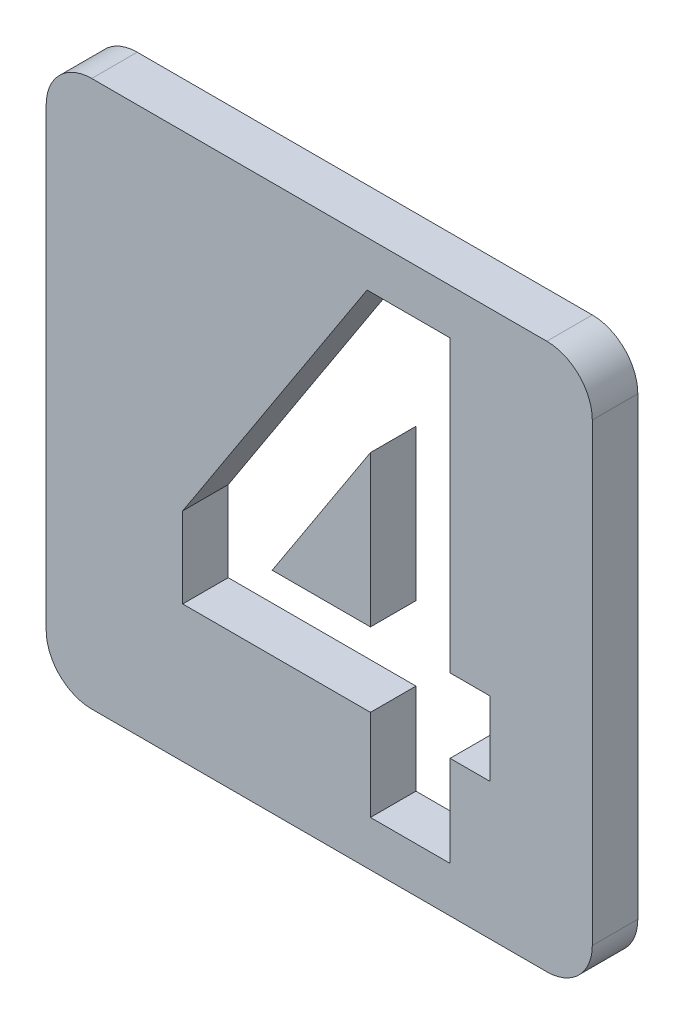
ISO-10303-21;
HEADER;
FILE_DESCRIPTION(('STEP AP214'),'2;1');
FILE_NAME('part.step','',(''),(''),'','','');
FILE_SCHEMA(('AUTOMOTIVE_DESIGN { 1 0 10303 214 1 1 1 1 }'));
ENDSEC;
DATA;
#1=APPLICATION_CONTEXT('core data for automotive mechanical design processes');
#2=APPLICATION_PROTOCOL_DEFINITION('international standard','automotive_design',2000,#1);
#3=PRODUCT_CONTEXT('',#1,'mechanical');
#4=PRODUCT('Part','Part','',(#3));
#5=PRODUCT_RELATED_PRODUCT_CATEGORY('part','',(#4));
#6=PRODUCT_DEFINITION_FORMATION('','',#4);
#7=PRODUCT_DEFINITION_CONTEXT('part definition',#1,'design');
#8=PRODUCT_DEFINITION('design','',#6,#7);
#9=PRODUCT_DEFINITION_SHAPE('','',#8);
#10=(LENGTH_UNIT() NAMED_UNIT(*) SI_UNIT(.MILLI.,.METRE.));
#11=(NAMED_UNIT(*) PLANE_ANGLE_UNIT() SI_UNIT($,.RADIAN.));
#12=(NAMED_UNIT(*) SI_UNIT($,.STERADIAN.) SOLID_ANGLE_UNIT());
#13=UNCERTAINTY_MEASURE_WITH_UNIT(LENGTH_MEASURE(1.E-05),#10,'distance_accuracy_value','');
#14=(GEOMETRIC_REPRESENTATION_CONTEXT(3) GLOBAL_UNCERTAINTY_ASSIGNED_CONTEXT((#13)) GLOBAL_UNIT_ASSIGNED_CONTEXT((#10,
#11,#12)) REPRESENTATION_CONTEXT('',''));
#15=CARTESIAN_POINT('',(0.,0.,0.));
#16=DIRECTION('',(0.,0.,1.));
#17=DIRECTION('',(1.,0.,0.));
#18=AXIS2_PLACEMENT_3D('',#15,#16,#17);
#19=CARTESIAN_POINT('',(50.,50.,10.));
#20=DIRECTION('',(0.,0.,-1.));
#21=DIRECTION('',(-1.,0.,0.));
#22=AXIS2_PLACEMENT_3D('',#19,#20,#21);
#23=PLANE('',#22);
#24=DIRECTION('',(1.,0.,0.));
#25=VECTOR('',#24,1.);
#26=CARTESIAN_POINT('',(-49.9999999999999,60.,10.));
#27=LINE('',#26,#25);
#28=CARTESIAN_POINT('',(-49.9999999999999,60.,10.));
#29=VERTEX_POINT('',#28);
#30=CARTESIAN_POINT('',(49.9999999999999,60.,10.));
#31=VERTEX_POINT('',#30);
#32=EDGE_CURVE('E236',#29,#31,#27,.T.);
#33=ORIENTED_EDGE('',*,*,#32,.F.);
#34=CARTESIAN_POINT('',(-50.,50.,10.));
#35=DIRECTION('',(0.,0.,1.));
#36=DIRECTION('',(1.,0.,0.));
#37=AXIS2_PLACEMENT_3D('',#34,#35,#36);
#38=CIRCLE('',#37,10.);
#39=CARTESIAN_POINT('',(-60.,49.9999999999999,10.));
#40=VERTEX_POINT('',#39);
#41=EDGE_CURVE('E378',#29,#40,#38,.T.);
#42=ORIENTED_EDGE('',*,*,#41,.T.);
#43=DIRECTION('',(0.,-1.,0.));
#44=VECTOR('',#43,1.);
#45=CARTESIAN_POINT('',(-60.,49.9999999999999,10.));
#46=LINE('',#45,#44);
#47=CARTESIAN_POINT('',(-60.,-49.9999999999999,10.));
#48=VERTEX_POINT('',#47);
#49=EDGE_CURVE('E380',#40,#48,#46,.T.);
#50=ORIENTED_EDGE('',*,*,#49,.T.);
#51=CARTESIAN_POINT('',(-50.,-50.,10.));
#52=DIRECTION('',(0.,0.,1.));
#53=DIRECTION('',(1.,0.,0.));
#54=AXIS2_PLACEMENT_3D('',#51,#52,#53);
#55=CIRCLE('',#54,10.);
#56=CARTESIAN_POINT('',(-49.9999999999999,-60.,10.));
#57=VERTEX_POINT('',#56);
#58=EDGE_CURVE('E382',#48,#57,#55,.T.);
#59=ORIENTED_EDGE('',*,*,#58,.T.);
#60=DIRECTION('',(1.,0.,0.));
#61=VECTOR('',#60,1.);
#62=CARTESIAN_POINT('',(-49.9999999999999,-60.,10.));
#63=LINE('',#62,#61);
#64=CARTESIAN_POINT('',(49.9999999999999,-60.,10.));
#65=VERTEX_POINT('',#64);
#66=EDGE_CURVE('E384',#57,#65,#63,.T.);
#67=ORIENTED_EDGE('',*,*,#66,.T.);
#68=CARTESIAN_POINT('',(50.,-50.,10.));
#69=DIRECTION('',(0.,0.,1.));
#70=DIRECTION('',(1.,0.,0.));
#71=AXIS2_PLACEMENT_3D('',#68,#69,#70);
#72=CIRCLE('',#71,10.);
#73=CARTESIAN_POINT('',(60.,-50.,10.));
#74=VERTEX_POINT('',#73);
#75=EDGE_CURVE('E208',#65,#74,#72,.T.);
#76=ORIENTED_EDGE('',*,*,#75,.T.);
#77=DIRECTION('',(0.,-1.,0.));
#78=VECTOR('',#77,1.);
#79=CARTESIAN_POINT('',(60.,49.9999999999999,10.));
#80=LINE('',#79,#78);
#81=CARTESIAN_POINT('',(60.,49.9999999999999,10.));
#82=VERTEX_POINT('',#81);
#83=EDGE_CURVE('E387',#82,#74,#80,.T.);
#84=ORIENTED_EDGE('',*,*,#83,.F.);
#85=CARTESIAN_POINT('',(50.,50.,10.));
#86=DIRECTION('',(0.,0.,-1.));
#87=DIRECTION('',(-1.,0.,0.));
#88=AXIS2_PLACEMENT_3D('',#85,#86,#87);
#89=CIRCLE('',#88,10.);
#90=EDGE_CURVE('E391',#31,#82,#89,.T.);
#91=ORIENTED_EDGE('',*,*,#90,.F.);
#92=EDGE_LOOP('',(#33,#42,#50,#59,#67,#76,#84,#91));
#93=FACE_BOUND('',#92,.T.);
#94=DIRECTION('',(0.545200849923092,0.838305453425622,0.));
#95=VECTOR('',#94,1.);
#96=CARTESIAN_POINT('',(-30.,-12.28515625,10.));
#97=LINE('',#96,#95);
#98=CARTESIAN_POINT('',(-30.,-12.28515625,10.));
#99=VERTEX_POINT('',#98);
#100=CARTESIAN_POINT('',(10.5078125,50.,10.));
#101=VERTEX_POINT('',#100);
#102=EDGE_CURVE('E115',#99,#101,#97,.T.);
#103=ORIENTED_EDGE('',*,*,#102,.T.);
#104=DIRECTION('',(1.,0.,0.));
#105=VECTOR('',#104,1.);
#106=CARTESIAN_POINT('',(10.5078125,50.,10.));
#107=LINE('',#106,#105);
#108=CARTESIAN_POINT('',(28.75,50.,10.));
#109=VERTEX_POINT('',#108);
#110=EDGE_CURVE('E105',#101,#109,#107,.T.);
#111=ORIENTED_EDGE('',*,*,#110,.T.);
#112=DIRECTION('',(0.,-1.,0.));
#113=VECTOR('',#112,1.);
#114=CARTESIAN_POINT('',(28.75,50.,10.));
#115=LINE('',#114,#113);
#116=CARTESIAN_POINT('',(28.75,-13.75,10.));
#117=VERTEX_POINT('',#116);
#118=EDGE_CURVE('E186',#109,#117,#115,.T.);
#119=ORIENTED_EDGE('',*,*,#118,.T.);
#120=DIRECTION('',(1.,0.,0.));
#121=VECTOR('',#120,1.);
#122=CARTESIAN_POINT('',(28.75,-13.75,10.));
#123=LINE('',#122,#121);
#124=CARTESIAN_POINT('',(37.5,-13.75,10.));
#125=VERTEX_POINT('',#124);
#126=EDGE_CURVE('E194',#117,#125,#123,.T.);
#127=ORIENTED_EDGE('',*,*,#126,.T.);
#128=DIRECTION('',(0.,-1.,0.));
#129=VECTOR('',#128,1.);
#130=CARTESIAN_POINT('',(37.5,-13.75,10.));
#131=LINE('',#130,#129);
#132=CARTESIAN_POINT('',(37.5,-30.,10.));
#133=VERTEX_POINT('',#132);
#134=EDGE_CURVE('E201',#125,#133,#131,.T.);
#135=ORIENTED_EDGE('',*,*,#134,.T.);
#136=DIRECTION('',(-1.,0.,0.));
#137=VECTOR('',#136,1.);
#138=CARTESIAN_POINT('',(37.5,-30.,10.));
#139=LINE('',#138,#137);
#140=CARTESIAN_POINT('',(28.75,-30.,10.));
#141=VERTEX_POINT('',#140);
#142=EDGE_CURVE('E262',#133,#141,#139,.T.);
#143=ORIENTED_EDGE('',*,*,#142,.T.);
#144=DIRECTION('',(0.,-1.,0.));
#145=VECTOR('',#144,1.);
#146=CARTESIAN_POINT('',(28.75,-30.,10.));
#147=LINE('',#146,#145);
#148=CARTESIAN_POINT('',(28.75,-50.,10.));
#149=VERTEX_POINT('',#148);
#150=EDGE_CURVE('E259',#141,#149,#147,.T.);
#151=ORIENTED_EDGE('',*,*,#150,.T.);
#152=DIRECTION('',(-1.,0.,0.));
#153=VECTOR('',#152,1.);
#154=CARTESIAN_POINT('',(28.75,-50.,10.));
#155=LINE('',#154,#153);
#156=CARTESIAN_POINT('',(11.25,-50.,10.));
#157=VERTEX_POINT('',#156);
#158=EDGE_CURVE('E256',#149,#157,#155,.T.);
#159=ORIENTED_EDGE('',*,*,#158,.T.);
#160=DIRECTION('',(0.,1.,0.));
#161=VECTOR('',#160,1.);
#162=CARTESIAN_POINT('',(11.25,-50.,10.));
#163=LINE('',#162,#161);
#164=CARTESIAN_POINT('',(11.25,-30.,10.));
#165=VERTEX_POINT('',#164);
#166=EDGE_CURVE('E253',#157,#165,#163,.T.);
#167=ORIENTED_EDGE('',*,*,#166,.T.);
#168=DIRECTION('',(-1.,0.,0.));
#169=VECTOR('',#168,1.);
#170=CARTESIAN_POINT('',(11.25,-30.,10.));
#171=LINE('',#170,#169);
#172=CARTESIAN_POINT('',(-30.,-30.,10.));
#173=VERTEX_POINT('',#172);
#174=EDGE_CURVE('E250',#165,#173,#171,.T.);
#175=ORIENTED_EDGE('',*,*,#174,.T.);
#176=DIRECTION('',(0.,1.,0.));
#177=VECTOR('',#176,1.);
#178=CARTESIAN_POINT('',(-30.,-30.,10.));
#179=LINE('',#178,#177);
#180=EDGE_CURVE('E246',#173,#99,#179,.T.);
#181=ORIENTED_EDGE('',*,*,#180,.T.);
#182=EDGE_LOOP('',(#103,#111,#119,#127,#135,#143,#151,#159,#167,#175,#181));
#183=FACE_BOUND('',#182,.T.);
#184=ADVANCED_FACE('F43',(#93,#183),#23,.F.);
#185=CARTESIAN_POINT('',(50.,50.,0.));
#186=DIRECTION('',(0.,0.,-1.));
#187=DIRECTION('',(-1.,0.,0.));
#188=AXIS2_PLACEMENT_3D('',#185,#186,#187);
#189=PLANE('',#188);
#190=DIRECTION('',(1.,0.,0.));
#191=VECTOR('',#190,1.);
#192=CARTESIAN_POINT('',(-49.9999999999999,60.,0.));
#193=LINE('',#192,#191);
#194=CARTESIAN_POINT('',(-49.9999999999999,60.,0.));
#195=VERTEX_POINT('',#194);
#196=CARTESIAN_POINT('',(49.9999999999999,60.,0.));
#197=VERTEX_POINT('',#196);
#198=EDGE_CURVE('E249',#195,#197,#193,.T.);
#199=ORIENTED_EDGE('',*,*,#198,.T.);
#200=CARTESIAN_POINT('',(50.,50.,0.));
#201=DIRECTION('',(0.,0.,-1.));
#202=DIRECTION('',(-1.,0.,0.));
#203=AXIS2_PLACEMENT_3D('',#200,#201,#202);
#204=CIRCLE('',#203,10.);
#205=CARTESIAN_POINT('',(60.,49.9999999999999,0.));
#206=VERTEX_POINT('',#205);
#207=EDGE_CURVE('E363',#197,#206,#204,.T.);
#208=ORIENTED_EDGE('',*,*,#207,.T.);
#209=DIRECTION('',(0.,-1.,0.));
#210=VECTOR('',#209,1.);
#211=CARTESIAN_POINT('',(60.,49.9999999999999,0.));
#212=LINE('',#211,#210);
#213=CARTESIAN_POINT('',(60.,-50.,0.));
#214=VERTEX_POINT('',#213);
#215=EDGE_CURVE('E369',#206,#214,#212,.T.);
#216=ORIENTED_EDGE('',*,*,#215,.T.);
#217=CARTESIAN_POINT('',(50.,-50.,0.));
#218=DIRECTION('',(0.,0.,1.));
#219=DIRECTION('',(1.,0.,0.));
#220=AXIS2_PLACEMENT_3D('',#217,#218,#219);
#221=CIRCLE('',#220,10.);
#222=CARTESIAN_POINT('',(49.9999999999999,-60.,0.));
#223=VERTEX_POINT('',#222);
#224=EDGE_CURVE('E400',#223,#214,#221,.T.);
#225=ORIENTED_EDGE('',*,*,#224,.F.);
#226=DIRECTION('',(1.,0.,0.));
#227=VECTOR('',#226,1.);
#228=CARTESIAN_POINT('',(-49.9999999999999,-60.,0.));
#229=LINE('',#228,#227);
#230=CARTESIAN_POINT('',(-49.9999999999999,-60.,0.));
#231=VERTEX_POINT('',#230);
#232=EDGE_CURVE('E404',#231,#223,#229,.T.);
#233=ORIENTED_EDGE('',*,*,#232,.F.);
#234=CARTESIAN_POINT('',(-50.,-50.,0.));
#235=DIRECTION('',(0.,0.,1.));
#236=DIRECTION('',(1.,0.,0.));
#237=AXIS2_PLACEMENT_3D('',#234,#235,#236);
#238=CIRCLE('',#237,10.);
#239=CARTESIAN_POINT('',(-60.,-49.9999999999999,0.));
#240=VERTEX_POINT('',#239);
#241=EDGE_CURVE('E408',#240,#231,#238,.T.);
#242=ORIENTED_EDGE('',*,*,#241,.F.);
#243=DIRECTION('',(0.,-1.,0.));
#244=VECTOR('',#243,1.);
#245=CARTESIAN_POINT('',(-60.,49.9999999999999,0.));
#246=LINE('',#245,#244);
#247=CARTESIAN_POINT('',(-60.,49.9999999999999,0.));
#248=VERTEX_POINT('',#247);
#249=EDGE_CURVE('E412',#248,#240,#246,.T.);
#250=ORIENTED_EDGE('',*,*,#249,.F.);
#251=CARTESIAN_POINT('',(-50.,50.,0.));
#252=DIRECTION('',(0.,0.,1.));
#253=DIRECTION('',(1.,0.,0.));
#254=AXIS2_PLACEMENT_3D('',#251,#252,#253);
#255=CIRCLE('',#254,10.);
#256=EDGE_CURVE('E374',#195,#248,#255,.T.);
#257=ORIENTED_EDGE('',*,*,#256,.F.);
#258=EDGE_LOOP('',(#199,#208,#216,#225,#233,#242,#250,#257));
#259=FACE_BOUND('',#258,.T.);
#260=DIRECTION('',(1.,0.,0.));
#261=VECTOR('',#260,1.);
#262=CARTESIAN_POINT('',(10.5078125,50.,0.));
#263=LINE('',#262,#261);
#264=CARTESIAN_POINT('',(10.5078125,50.,0.));
#265=VERTEX_POINT('',#264);
#266=CARTESIAN_POINT('',(28.75,50.,0.));
#267=VERTEX_POINT('',#266);
#268=EDGE_CURVE('E101',#265,#267,#263,.T.);
#269=ORIENTED_EDGE('',*,*,#268,.F.);
#270=DIRECTION('',(0.545200849923092,0.838305453425622,0.));
#271=VECTOR('',#270,1.);
#272=CARTESIAN_POINT('',(-30.,-12.28515625,0.));
#273=LINE('',#272,#271);
#274=CARTESIAN_POINT('',(-30.,-12.28515625,0.));
#275=VERTEX_POINT('',#274);
#276=EDGE_CURVE('E46',#275,#265,#273,.T.);
#277=ORIENTED_EDGE('',*,*,#276,.F.);
#278=DIRECTION('',(0.,1.,0.));
#279=VECTOR('',#278,1.);
#280=CARTESIAN_POINT('',(-30.,-30.,0.));
#281=LINE('',#280,#279);
#282=CARTESIAN_POINT('',(-30.,-30.,0.));
#283=VERTEX_POINT('',#282);
#284=EDGE_CURVE('E52',#283,#275,#281,.T.);
#285=ORIENTED_EDGE('',*,*,#284,.F.);
#286=DIRECTION('',(-1.,0.,0.));
#287=VECTOR('',#286,1.);
#288=CARTESIAN_POINT('',(11.25,-30.,0.));
#289=LINE('',#288,#287);
#290=CARTESIAN_POINT('',(11.25,-30.,0.));
#291=VERTEX_POINT('',#290);
#292=EDGE_CURVE('E211',#291,#283,#289,.T.);
#293=ORIENTED_EDGE('',*,*,#292,.F.);
#294=DIRECTION('',(0.,1.,0.));
#295=VECTOR('',#294,1.);
#296=CARTESIAN_POINT('',(11.25,-50.,0.));
#297=LINE('',#296,#295);
#298=CARTESIAN_POINT('',(11.25,-50.,0.));
#299=VERTEX_POINT('',#298);
#300=EDGE_CURVE('E215',#299,#291,#297,.T.);
#301=ORIENTED_EDGE('',*,*,#300,.F.);
#302=DIRECTION('',(-1.,0.,0.));
#303=VECTOR('',#302,1.);
#304=CARTESIAN_POINT('',(28.75,-50.,0.));
#305=LINE('',#304,#303);
#306=CARTESIAN_POINT('',(28.75,-50.,0.));
#307=VERTEX_POINT('',#306);
#308=EDGE_CURVE('E218',#307,#299,#305,.T.);
#309=ORIENTED_EDGE('',*,*,#308,.F.);
#310=DIRECTION('',(0.,-1.,0.));
#311=VECTOR('',#310,1.);
#312=CARTESIAN_POINT('',(28.75,-30.,0.));
#313=LINE('',#312,#311);
#314=CARTESIAN_POINT('',(28.75,-30.,0.));
#315=VERTEX_POINT('',#314);
#316=EDGE_CURVE('E221',#315,#307,#313,.T.);
#317=ORIENTED_EDGE('',*,*,#316,.F.);
#318=DIRECTION('',(-1.,0.,0.));
#319=VECTOR('',#318,1.);
#320=CARTESIAN_POINT('',(37.5,-30.,0.));
#321=LINE('',#320,#319);
#322=CARTESIAN_POINT('',(37.5,-30.,0.));
#323=VERTEX_POINT('',#322);
#324=EDGE_CURVE('E224',#323,#315,#321,.T.);
#325=ORIENTED_EDGE('',*,*,#324,.F.);
#326=DIRECTION('',(0.,-1.,0.));
#327=VECTOR('',#326,1.);
#328=CARTESIAN_POINT('',(37.5,-13.75,0.));
#329=LINE('',#328,#327);
#330=CARTESIAN_POINT('',(37.5,-13.75,0.));
#331=VERTEX_POINT('',#330);
#332=EDGE_CURVE('E227',#331,#323,#329,.T.);
#333=ORIENTED_EDGE('',*,*,#332,.F.);
#334=DIRECTION('',(1.,0.,0.));
#335=VECTOR('',#334,1.);
#336=CARTESIAN_POINT('',(28.75,-13.75,0.));
#337=LINE('',#336,#335);
#338=CARTESIAN_POINT('',(28.75,-13.75,0.));
#339=VERTEX_POINT('',#338);
#340=EDGE_CURVE('E191',#339,#331,#337,.T.);
#341=ORIENTED_EDGE('',*,*,#340,.F.);
#342=DIRECTION('',(0.,-1.,0.));
#343=VECTOR('',#342,1.);
#344=CARTESIAN_POINT('',(28.75,50.,0.));
#345=LINE('',#344,#343);
#346=EDGE_CURVE('E188',#267,#339,#345,.T.);
#347=ORIENTED_EDGE('',*,*,#346,.F.);
#348=EDGE_LOOP('',(#269,#277,#285,#293,#301,#309,#317,#325,#333,#341,#347));
#349=FACE_BOUND('',#348,.T.);
#350=ADVANCED_FACE('F296',(#259,#349),#189,.T.);
#351=CARTESIAN_POINT('',(-49.9999999999999,60.,10.));
#352=DIRECTION('',(0.,1.,0.));
#353=DIRECTION('',(0.,0.,1.));
#354=AXIS2_PLACEMENT_3D('',#351,#352,#353);
#355=PLANE('',#354);
#356=ORIENTED_EDGE('',*,*,#198,.F.);
#357=DIRECTION('',(0.,0.,-1.));
#358=VECTOR('',#357,1.);
#359=CARTESIAN_POINT('',(-49.9999999999999,60.,10.));
#360=LINE('',#359,#358);
#361=EDGE_CURVE('E413',#29,#195,#360,.T.);
#362=ORIENTED_EDGE('',*,*,#361,.F.);
#363=ORIENTED_EDGE('',*,*,#32,.T.);
#364=DIRECTION('',(0.,0.,-1.));
#365=VECTOR('',#364,1.);
#366=CARTESIAN_POINT('',(49.9999999999999,60.,10.));
#367=LINE('',#366,#365);
#368=EDGE_CURVE('E365',#31,#197,#367,.T.);
#369=ORIENTED_EDGE('',*,*,#368,.T.);
#370=EDGE_LOOP('',(#356,#362,#363,#369));
#371=FACE_BOUND('',#370,.T.);
#372=ADVANCED_FACE('F298',(#371),#355,.T.);
#373=CARTESIAN_POINT('',(-50.,50.,10.));
#374=DIRECTION('',(0.,0.,-1.));
#375=DIRECTION('',(-1.,0.,0.));
#376=AXIS2_PLACEMENT_3D('',#373,#374,#375);
#377=CYLINDRICAL_SURFACE('',#376,10.);
#378=ORIENTED_EDGE('',*,*,#256,.T.);
#379=DIRECTION('',(0.,0.,-1.));
#380=VECTOR('',#379,1.);
#381=CARTESIAN_POINT('',(-60.,49.9999999999999,10.));
#382=LINE('',#381,#380);
#383=EDGE_CURVE('E409',#40,#248,#382,.T.);
#384=ORIENTED_EDGE('',*,*,#383,.F.);
#385=ORIENTED_EDGE('',*,*,#41,.F.);
#386=ORIENTED_EDGE('',*,*,#361,.T.);
#387=EDGE_LOOP('',(#378,#384,#385,#386));
#388=FACE_BOUND('',#387,.T.);
#389=ADVANCED_FACE('F304',(#388),#377,.T.);
#390=CARTESIAN_POINT('',(-60.,49.9999999999999,10.));
#391=DIRECTION('',(1.,0.,0.));
#392=DIRECTION('',(0.,1.,0.));
#393=AXIS2_PLACEMENT_3D('',#390,#391,#392);
#394=PLANE('',#393);
#395=ORIENTED_EDGE('',*,*,#249,.T.);
#396=DIRECTION('',(0.,0.,-1.));
#397=VECTOR('',#396,1.);
#398=CARTESIAN_POINT('',(-60.,-49.9999999999999,10.));
#399=LINE('',#398,#397);
#400=EDGE_CURVE('E405',#48,#240,#399,.T.);
#401=ORIENTED_EDGE('',*,*,#400,.F.);
#402=ORIENTED_EDGE('',*,*,#49,.F.);
#403=ORIENTED_EDGE('',*,*,#383,.T.);
#404=EDGE_LOOP('',(#395,#401,#402,#403));
#405=FACE_BOUND('',#404,.T.);
#406=ADVANCED_FACE('F336',(#405),#394,.F.);
#407=CARTESIAN_POINT('',(-50.,-50.,10.));
#408=DIRECTION('',(0.,0.,-1.));
#409=DIRECTION('',(-1.,0.,0.));
#410=AXIS2_PLACEMENT_3D('',#407,#408,#409);
#411=CYLINDRICAL_SURFACE('',#410,10.);
#412=ORIENTED_EDGE('',*,*,#241,.T.);
#413=DIRECTION('',(0.,0.,-1.));
#414=VECTOR('',#413,1.);
#415=CARTESIAN_POINT('',(-49.9999999999999,-60.,10.));
#416=LINE('',#415,#414);
#417=EDGE_CURVE('E401',#57,#231,#416,.T.);
#418=ORIENTED_EDGE('',*,*,#417,.F.);
#419=ORIENTED_EDGE('',*,*,#58,.F.);
#420=ORIENTED_EDGE('',*,*,#400,.T.);
#421=EDGE_LOOP('',(#412,#418,#419,#420));
#422=FACE_BOUND('',#421,.T.);
#423=ADVANCED_FACE('F340',(#422),#411,.T.);
#424=CARTESIAN_POINT('',(-49.9999999999999,-60.,10.));
#425=DIRECTION('',(0.,1.,0.));
#426=DIRECTION('',(0.,0.,1.));
#427=AXIS2_PLACEMENT_3D('',#424,#425,#426);
#428=PLANE('',#427);
#429=ORIENTED_EDGE('',*,*,#232,.T.);
#430=DIRECTION('',(0.,0.,-1.));
#431=VECTOR('',#430,1.);
#432=CARTESIAN_POINT('',(49.9999999999999,-60.,10.));
#433=LINE('',#432,#431);
#434=EDGE_CURVE('E390',#65,#223,#433,.T.);
#435=ORIENTED_EDGE('',*,*,#434,.F.);
#436=ORIENTED_EDGE('',*,*,#66,.F.);
#437=ORIENTED_EDGE('',*,*,#417,.T.);
#438=EDGE_LOOP('',(#429,#435,#436,#437));
#439=FACE_BOUND('',#438,.T.);
#440=ADVANCED_FACE('F344',(#439),#428,.F.);
#441=CARTESIAN_POINT('',(50.,-50.,10.));
#442=DIRECTION('',(0.,0.,-1.));
#443=DIRECTION('',(-1.,0.,0.));
#444=AXIS2_PLACEMENT_3D('',#441,#442,#443);
#445=CYLINDRICAL_SURFACE('',#444,10.);
#446=ORIENTED_EDGE('',*,*,#224,.T.);
#447=DIRECTION('',(0.,0.,-1.));
#448=VECTOR('',#447,1.);
#449=CARTESIAN_POINT('',(60.,-50.,10.));
#450=LINE('',#449,#448);
#451=EDGE_CURVE('E389',#74,#214,#450,.T.);
#452=ORIENTED_EDGE('',*,*,#451,.F.);
#453=ORIENTED_EDGE('',*,*,#75,.F.);
#454=ORIENTED_EDGE('',*,*,#434,.T.);
#455=EDGE_LOOP('',(#446,#452,#453,#454));
#456=FACE_BOUND('',#455,.T.);
#457=ADVANCED_FACE('F348',(#456),#445,.T.);
#458=CARTESIAN_POINT('',(60.,49.9999999999999,10.));
#459=DIRECTION('',(1.,0.,0.));
#460=DIRECTION('',(0.,1.,0.));
#461=AXIS2_PLACEMENT_3D('',#458,#459,#460);
#462=PLANE('',#461);
#463=ORIENTED_EDGE('',*,*,#215,.F.);
#464=DIRECTION('',(0.,0.,-1.));
#465=VECTOR('',#464,1.);
#466=CARTESIAN_POINT('',(60.,49.9999999999999,10.));
#467=LINE('',#466,#465);
#468=EDGE_CURVE('E234',#82,#206,#467,.T.);
#469=ORIENTED_EDGE('',*,*,#468,.F.);
#470=ORIENTED_EDGE('',*,*,#83,.T.);
#471=ORIENTED_EDGE('',*,*,#451,.T.);
#472=EDGE_LOOP('',(#463,#469,#470,#471));
#473=FACE_BOUND('',#472,.T.);
#474=ADVANCED_FACE('F352',(#473),#462,.T.);
#475=CARTESIAN_POINT('',(50.,50.,10.));
#476=DIRECTION('',(0.,0.,-1.));
#477=DIRECTION('',(-1.,0.,0.));
#478=AXIS2_PLACEMENT_3D('',#475,#476,#477);
#479=CYLINDRICAL_SURFACE('',#478,10.);
#480=ORIENTED_EDGE('',*,*,#207,.F.);
#481=ORIENTED_EDGE('',*,*,#368,.F.);
#482=ORIENTED_EDGE('',*,*,#90,.T.);
#483=ORIENTED_EDGE('',*,*,#468,.T.);
#484=EDGE_LOOP('',(#480,#481,#482,#483));
#485=FACE_BOUND('',#484,.T.);
#486=ADVANCED_FACE('F333',(#485),#479,.T.);
#487=CARTESIAN_POINT('',(-30.,-12.28515625,0.));
#488=DIRECTION('',(0.838305453425622,-0.545200849923092,0.));
#489=DIRECTION('',(0.545200849923092,0.838305453425622,0.));
#490=AXIS2_PLACEMENT_3D('',#487,#488,#489);
#491=PLANE('',#490);
#492=ORIENTED_EDGE('',*,*,#102,.F.);
#493=DIRECTION('',(0.,0.,1.));
#494=VECTOR('',#493,1.);
#495=CARTESIAN_POINT('',(-30.,-12.28515625,0.));
#496=LINE('',#495,#494);
#497=EDGE_CURVE('E12',#275,#99,#496,.T.);
#498=ORIENTED_EDGE('',*,*,#497,.F.);
#499=ORIENTED_EDGE('',*,*,#276,.T.);
#500=DIRECTION('',(0.,0.,1.));
#501=VECTOR('',#500,1.);
#502=CARTESIAN_POINT('',(10.5078125,50.,0.));
#503=LINE('',#502,#501);
#504=EDGE_CURVE('E231',#265,#101,#503,.T.);
#505=ORIENTED_EDGE('',*,*,#504,.T.);
#506=EDGE_LOOP('',(#492,#498,#499,#505));
#507=FACE_BOUND('',#506,.T.);
#508=ADVANCED_FACE('F294',(#507),#491,.T.);
#509=CARTESIAN_POINT('',(10.5078125,50.,0.));
#510=DIRECTION('',(0.,-1.,0.));
#511=DIRECTION('',(0.,0.,-1.));
#512=AXIS2_PLACEMENT_3D('',#509,#510,#511);
#513=PLANE('',#512);
#514=ORIENTED_EDGE('',*,*,#110,.F.);
#515=ORIENTED_EDGE('',*,*,#504,.F.);
#516=ORIENTED_EDGE('',*,*,#268,.T.);
#517=DIRECTION('',(0.,0.,1.));
#518=VECTOR('',#517,1.);
#519=CARTESIAN_POINT('',(28.75,50.,0.));
#520=LINE('',#519,#518);
#521=EDGE_CURVE('E230',#267,#109,#520,.T.);
#522=ORIENTED_EDGE('',*,*,#521,.T.);
#523=EDGE_LOOP('',(#514,#515,#516,#522));
#524=FACE_BOUND('',#523,.T.);
#525=ADVANCED_FACE('F328',(#524),#513,.T.);
#526=CARTESIAN_POINT('',(28.75,50.,0.));
#527=DIRECTION('',(-1.,0.,0.));
#528=DIRECTION('',(0.,0.,1.));
#529=AXIS2_PLACEMENT_3D('',#526,#527,#528);
#530=PLANE('',#529);
#531=ORIENTED_EDGE('',*,*,#118,.F.);
#532=ORIENTED_EDGE('',*,*,#521,.F.);
#533=ORIENTED_EDGE('',*,*,#346,.T.);
#534=DIRECTION('',(0.,0.,1.));
#535=VECTOR('',#534,1.);
#536=CARTESIAN_POINT('',(28.75,-13.75,0.));
#537=LINE('',#536,#535);
#538=EDGE_CURVE('E182',#339,#117,#537,.T.);
#539=ORIENTED_EDGE('',*,*,#538,.T.);
#540=EDGE_LOOP('',(#531,#532,#533,#539));
#541=FACE_BOUND('',#540,.T.);
#542=ADVANCED_FACE('F184',(#541),#530,.T.);
#543=CARTESIAN_POINT('',(28.75,-13.75,0.));
#544=DIRECTION('',(0.,-1.,0.));
#545=DIRECTION('',(0.,0.,-1.));
#546=AXIS2_PLACEMENT_3D('',#543,#544,#545);
#547=PLANE('',#546);
#548=ORIENTED_EDGE('',*,*,#126,.F.);
#549=ORIENTED_EDGE('',*,*,#538,.F.);
#550=ORIENTED_EDGE('',*,*,#340,.T.);
#551=DIRECTION('',(0.,0.,1.));
#552=VECTOR('',#551,1.);
#553=CARTESIAN_POINT('',(37.5,-13.75,0.));
#554=LINE('',#553,#552);
#555=EDGE_CURVE('E197',#331,#125,#554,.T.);
#556=ORIENTED_EDGE('',*,*,#555,.T.);
#557=EDGE_LOOP('',(#548,#549,#550,#556));
#558=FACE_BOUND('',#557,.T.);
#559=ADVANCED_FACE('F195',(#558),#547,.T.);
#560=CARTESIAN_POINT('',(37.5,-13.75,0.));
#561=DIRECTION('',(-1.,0.,0.));
#562=DIRECTION('',(0.,0.,1.));
#563=AXIS2_PLACEMENT_3D('',#560,#561,#562);
#564=PLANE('',#563);
#565=ORIENTED_EDGE('',*,*,#134,.F.);
#566=ORIENTED_EDGE('',*,*,#555,.F.);
#567=ORIENTED_EDGE('',*,*,#332,.T.);
#568=DIRECTION('',(0.,0.,1.));
#569=VECTOR('',#568,1.);
#570=CARTESIAN_POINT('',(37.5,-30.,0.));
#571=LINE('',#570,#569);
#572=EDGE_CURVE('E226',#323,#133,#571,.T.);
#573=ORIENTED_EDGE('',*,*,#572,.T.);
#574=EDGE_LOOP('',(#565,#566,#567,#573));
#575=FACE_BOUND('',#574,.T.);
#576=ADVANCED_FACE('F266',(#575),#564,.T.);
#577=CARTESIAN_POINT('',(37.5,-30.,0.));
#578=DIRECTION('',(0.,1.,0.));
#579=DIRECTION('',(0.,0.,1.));
#580=AXIS2_PLACEMENT_3D('',#577,#578,#579);
#581=PLANE('',#580);
#582=ORIENTED_EDGE('',*,*,#142,.F.);
#583=ORIENTED_EDGE('',*,*,#572,.F.);
#584=ORIENTED_EDGE('',*,*,#324,.T.);
#585=DIRECTION('',(0.,0.,1.));
#586=VECTOR('',#585,1.);
#587=CARTESIAN_POINT('',(28.75,-30.,0.));
#588=LINE('',#587,#586);
#589=EDGE_CURVE('E223',#315,#141,#588,.T.);
#590=ORIENTED_EDGE('',*,*,#589,.T.);
#591=EDGE_LOOP('',(#582,#583,#584,#590));
#592=FACE_BOUND('',#591,.T.);
#593=ADVANCED_FACE('F271',(#592),#581,.T.);
#594=CARTESIAN_POINT('',(28.75,-30.,0.));
#595=DIRECTION('',(-1.,0.,0.));
#596=DIRECTION('',(0.,0.,1.));
#597=AXIS2_PLACEMENT_3D('',#594,#595,#596);
#598=PLANE('',#597);
#599=ORIENTED_EDGE('',*,*,#150,.F.);
#600=ORIENTED_EDGE('',*,*,#589,.F.);
#601=ORIENTED_EDGE('',*,*,#316,.T.);
#602=DIRECTION('',(0.,0.,1.));
#603=VECTOR('',#602,1.);
#604=CARTESIAN_POINT('',(28.75,-50.,0.));
#605=LINE('',#604,#603);
#606=EDGE_CURVE('E220',#307,#149,#605,.T.);
#607=ORIENTED_EDGE('',*,*,#606,.T.);
#608=EDGE_LOOP('',(#599,#600,#601,#607));
#609=FACE_BOUND('',#608,.T.);
#610=ADVANCED_FACE('F276',(#609),#598,.T.);
#611=CARTESIAN_POINT('',(28.75,-50.,0.));
#612=DIRECTION('',(0.,1.,0.));
#613=DIRECTION('',(0.,0.,1.));
#614=AXIS2_PLACEMENT_3D('',#611,#612,#613);
#615=PLANE('',#614);
#616=ORIENTED_EDGE('',*,*,#158,.F.);
#617=ORIENTED_EDGE('',*,*,#606,.F.);
#618=ORIENTED_EDGE('',*,*,#308,.T.);
#619=DIRECTION('',(0.,0.,1.));
#620=VECTOR('',#619,1.);
#621=CARTESIAN_POINT('',(11.25,-50.,0.));
#622=LINE('',#621,#620);
#623=EDGE_CURVE('E217',#299,#157,#622,.T.);
#624=ORIENTED_EDGE('',*,*,#623,.T.);
#625=EDGE_LOOP('',(#616,#617,#618,#624));
#626=FACE_BOUND('',#625,.T.);
#627=ADVANCED_FACE('F281',(#626),#615,.T.);
#628=CARTESIAN_POINT('',(11.25,-50.,0.));
#629=DIRECTION('',(1.,0.,0.));
#630=DIRECTION('',(0.,0.,-1.));
#631=AXIS2_PLACEMENT_3D('',#628,#629,#630);
#632=PLANE('',#631);
#633=ORIENTED_EDGE('',*,*,#166,.F.);
#634=ORIENTED_EDGE('',*,*,#623,.F.);
#635=ORIENTED_EDGE('',*,*,#300,.T.);
#636=DIRECTION('',(0.,0.,1.));
#637=VECTOR('',#636,1.);
#638=CARTESIAN_POINT('',(11.25,-30.,0.));
#639=LINE('',#638,#637);
#640=EDGE_CURVE('E214',#291,#165,#639,.T.);
#641=ORIENTED_EDGE('',*,*,#640,.T.);
#642=EDGE_LOOP('',(#633,#634,#635,#641));
#643=FACE_BOUND('',#642,.T.);
#644=ADVANCED_FACE('F286',(#643),#632,.T.);
#645=CARTESIAN_POINT('',(11.25,-30.,0.));
#646=DIRECTION('',(0.,1.,0.));
#647=DIRECTION('',(0.,0.,1.));
#648=AXIS2_PLACEMENT_3D('',#645,#646,#647);
#649=PLANE('',#648);
#650=ORIENTED_EDGE('',*,*,#174,.F.);
#651=ORIENTED_EDGE('',*,*,#640,.F.);
#652=ORIENTED_EDGE('',*,*,#292,.T.);
#653=DIRECTION('',(0.,0.,1.));
#654=VECTOR('',#653,1.);
#655=CARTESIAN_POINT('',(-30.,-30.,0.));
#656=LINE('',#655,#654);
#657=EDGE_CURVE('E210',#283,#173,#656,.T.);
#658=ORIENTED_EDGE('',*,*,#657,.T.);
#659=EDGE_LOOP('',(#650,#651,#652,#658));
#660=FACE_BOUND('',#659,.T.);
#661=ADVANCED_FACE('F291',(#660),#649,.T.);
#662=CARTESIAN_POINT('',(-30.,-30.,0.));
#663=DIRECTION('',(1.,0.,0.));
#664=DIRECTION('',(0.,0.,-1.));
#665=AXIS2_PLACEMENT_3D('',#662,#663,#664);
#666=PLANE('',#665);
#667=ORIENTED_EDGE('',*,*,#180,.F.);
#668=ORIENTED_EDGE('',*,*,#657,.F.);
#669=ORIENTED_EDGE('',*,*,#284,.T.);
#670=ORIENTED_EDGE('',*,*,#497,.T.);
#671=EDGE_LOOP('',(#667,#668,#669,#670));
#672=FACE_BOUND('',#671,.T.);
#673=ADVANCED_FACE('F293',(#672),#666,.T.);
#674=CLOSED_SHELL('',(#184,#350,#372,#389,#406,#423,#440,#457,#474,#486,#508,#525,#542,#559,
#576,#593,#610,#627,#644,#661,#673));
#675=MANIFOLD_SOLID_BREP('B2',#674);
#676=CARTESIAN_POINT('',(50.,50.,0.));
#677=DIRECTION('',(0.,0.,-1.));
#678=DIRECTION('',(-1.,0.,0.));
#679=AXIS2_PLACEMENT_3D('',#676,#677,#678);
#680=PLANE('',#679);
#681=DIRECTION('',(0.,1.,0.));
#682=VECTOR('',#681,1.);
#683=CARTESIAN_POINT('',(11.25,-13.75,0.));
#684=LINE('',#683,#682);
#685=CARTESIAN_POINT('',(11.25,-13.75,0.));
#686=VERTEX_POINT('',#685);
#687=CARTESIAN_POINT('',(11.25,19.43359375,0.));
#688=VERTEX_POINT('',#687);
#689=EDGE_CURVE('E602',#686,#688,#684,.T.);
#690=ORIENTED_EDGE('',*,*,#689,.F.);
#691=DIRECTION('',(1.,0.,0.));
#692=VECTOR('',#691,1.);
#693=CARTESIAN_POINT('',(-10.33203125,-13.75,0.));
#694=LINE('',#693,#692);
#695=CARTESIAN_POINT('',(-10.33203125,-13.75,0.));
#696=VERTEX_POINT('',#695);
#697=EDGE_CURVE('E582',#696,#686,#694,.T.);
#698=ORIENTED_EDGE('',*,*,#697,.F.);
#699=DIRECTION('',(-0.54521378888392,-0.838297038293014,0.));
#700=VECTOR('',#699,1.);
#701=CARTESIAN_POINT('',(11.25,19.43359375,0.));
#702=LINE('',#701,#700);
#703=EDGE_CURVE('E597',#688,#696,#702,.T.);
#704=ORIENTED_EDGE('',*,*,#703,.F.);
#705=EDGE_LOOP('',(#690,#698,#704));
#706=FACE_BOUND('',#705,.T.);
#707=ADVANCED_FACE('F559',(#706),#680,.T.);
#708=CARTESIAN_POINT('',(11.25,-13.75,0.));
#709=DIRECTION('',(1.,0.,0.));
#710=DIRECTION('',(0.,0.,-1.));
#711=AXIS2_PLACEMENT_3D('',#708,#709,#710);
#712=PLANE('',#711);
#713=DIRECTION('',(0.,1.,0.));
#714=VECTOR('',#713,1.);
#715=CARTESIAN_POINT('',(11.25,-13.75,10.));
#716=LINE('',#715,#714);
#717=CARTESIAN_POINT('',(11.25,-13.75,10.));
#718=VERTEX_POINT('',#717);
#719=CARTESIAN_POINT('',(11.25,19.43359375,10.));
#720=VERTEX_POINT('',#719);
#721=EDGE_CURVE('E606',#718,#720,#716,.T.);
#722=ORIENTED_EDGE('',*,*,#721,.F.);
#723=DIRECTION('',(0.,0.,1.));
#724=VECTOR('',#723,1.);
#725=CARTESIAN_POINT('',(11.25,-13.75,0.));
#726=LINE('',#725,#724);
#727=EDGE_CURVE('E562',#686,#718,#726,.T.);
#728=ORIENTED_EDGE('',*,*,#727,.F.);
#729=ORIENTED_EDGE('',*,*,#689,.T.);
#730=DIRECTION('',(0.,0.,1.));
#731=VECTOR('',#730,1.);
#732=CARTESIAN_POINT('',(11.25,19.43359375,0.));
#733=LINE('',#732,#731);
#734=EDGE_CURVE('E567',#688,#720,#733,.T.);
#735=ORIENTED_EDGE('',*,*,#734,.T.);
#736=EDGE_LOOP('',(#722,#728,#729,#735));
#737=FACE_BOUND('',#736,.T.);
#738=ADVANCED_FACE('F613',(#737),#712,.T.);
#739=CARTESIAN_POINT('',(11.25,19.43359375,0.));
#740=DIRECTION('',(-0.838297038293014,0.54521378888392,0.));
#741=DIRECTION('',(-0.545213788883921,-0.838297038293015,0.));
#742=AXIS2_PLACEMENT_3D('',#739,#740,#741);
#743=PLANE('',#742);
#744=DIRECTION('',(-0.54521378888392,-0.838297038293014,0.));
#745=VECTOR('',#744,1.);
#746=CARTESIAN_POINT('',(11.25,19.43359375,10.));
#747=LINE('',#746,#745);
#748=CARTESIAN_POINT('',(-10.33203125,-13.75,10.));
#749=VERTEX_POINT('',#748);
#750=EDGE_CURVE('E574',#720,#749,#747,.T.);
#751=ORIENTED_EDGE('',*,*,#750,.F.);
#752=ORIENTED_EDGE('',*,*,#734,.F.);
#753=ORIENTED_EDGE('',*,*,#703,.T.);
#754=DIRECTION('',(0.,0.,1.));
#755=VECTOR('',#754,1.);
#756=CARTESIAN_POINT('',(-10.33203125,-13.75,0.));
#757=LINE('',#756,#755);
#758=EDGE_CURVE('E41',#696,#749,#757,.T.);
#759=ORIENTED_EDGE('',*,*,#758,.T.);
#760=EDGE_LOOP('',(#751,#752,#753,#759));
#761=FACE_BOUND('',#760,.T.);
#762=ADVANCED_FACE('F598',(#761),#743,.T.);
#763=CARTESIAN_POINT('',(-10.33203125,-13.75,0.));
#764=DIRECTION('',(0.,-1.,0.));
#765=DIRECTION('',(0.,0.,-1.));
#766=AXIS2_PLACEMENT_3D('',#763,#764,#765);
#767=PLANE('',#766);
#768=DIRECTION('',(1.,0.,0.));
#769=VECTOR('',#768,1.);
#770=CARTESIAN_POINT('',(-10.33203125,-13.75,10.));
#771=LINE('',#770,#769);
#772=EDGE_CURVE('E595',#749,#718,#771,.T.);
#773=ORIENTED_EDGE('',*,*,#772,.F.);
#774=ORIENTED_EDGE('',*,*,#758,.F.);
#775=ORIENTED_EDGE('',*,*,#697,.T.);
#776=ORIENTED_EDGE('',*,*,#727,.T.);
#777=EDGE_LOOP('',(#773,#774,#775,#776));
#778=FACE_BOUND('',#777,.T.);
#779=ADVANCED_FACE('F593',(#778),#767,.T.);
#780=CARTESIAN_POINT('',(50.,50.,10.));
#781=DIRECTION('',(0.,0.,-1.));
#782=DIRECTION('',(-1.,0.,0.));
#783=AXIS2_PLACEMENT_3D('',#780,#781,#782);
#784=PLANE('',#783);
#785=ORIENTED_EDGE('',*,*,#772,.T.);
#786=ORIENTED_EDGE('',*,*,#721,.T.);
#787=ORIENTED_EDGE('',*,*,#750,.T.);
#788=EDGE_LOOP('',(#785,#786,#787));
#789=FACE_BOUND('',#788,.T.);
#790=ADVANCED_FACE('F615',(#789),#784,.F.);
#791=CLOSED_SHELL('',(#707,#738,#762,#779,#790));
#792=MANIFOLD_SOLID_BREP('B6',#791);
#793=ADVANCED_BREP_SHAPE_REPRESENTATION('',(#18,#675,#792),#14);
#794=SHAPE_DEFINITION_REPRESENTATION(#9,#793);
ENDSEC;
END-ISO-10303-21;
